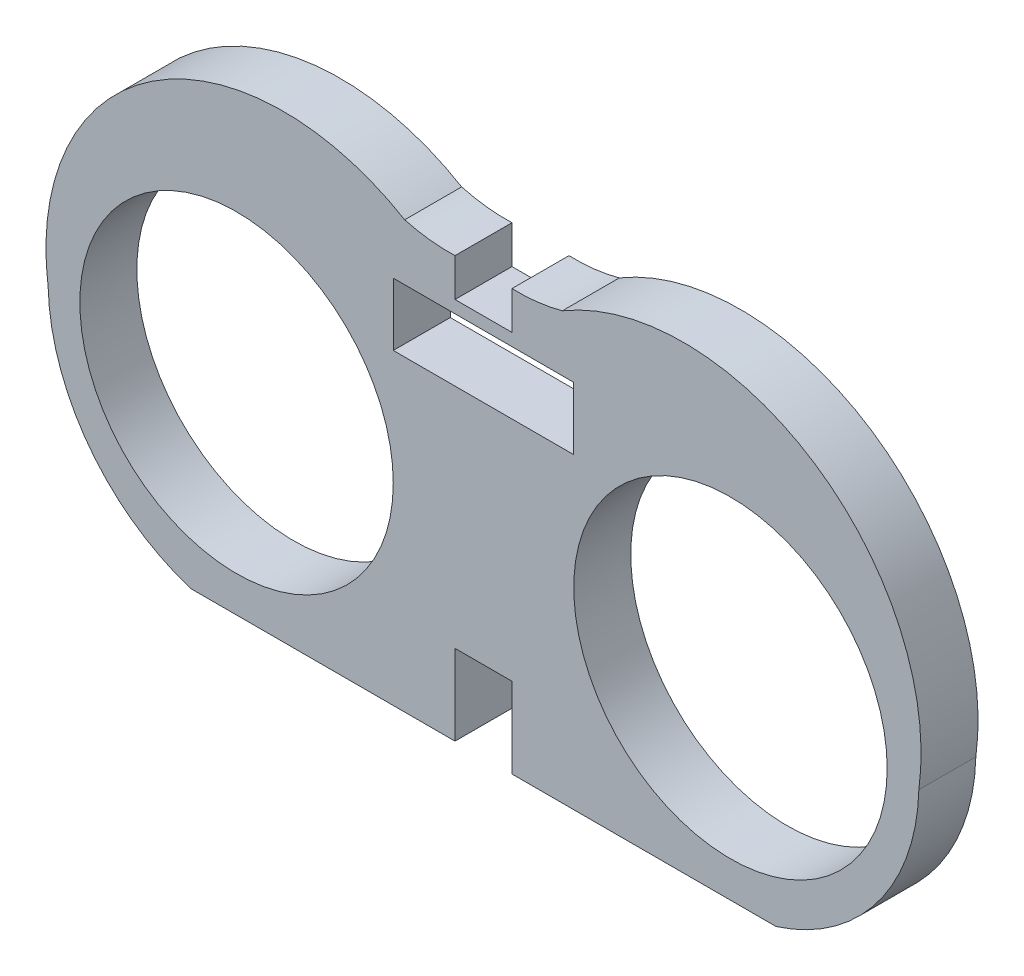
ISO-10303-21;
HEADER;
FILE_DESCRIPTION(('STEP AP214'),'2;1');
FILE_NAME('part.step','',(''),(''),'','','');
FILE_SCHEMA(('AUTOMOTIVE_DESIGN { 1 0 10303 214 1 1 1 1 }'));
ENDSEC;
DATA;
#1=APPLICATION_CONTEXT('core data for automotive mechanical design processes');
#2=APPLICATION_PROTOCOL_DEFINITION('international standard','automotive_design',2000,#1);
#3=PRODUCT_CONTEXT('',#1,'mechanical');
#4=PRODUCT('Part','Part','',(#3));
#5=PRODUCT_RELATED_PRODUCT_CATEGORY('part','',(#4));
#6=PRODUCT_DEFINITION_FORMATION('','',#4);
#7=PRODUCT_DEFINITION_CONTEXT('part definition',#1,'design');
#8=PRODUCT_DEFINITION('design','',#6,#7);
#9=PRODUCT_DEFINITION_SHAPE('','',#8);
#10=(LENGTH_UNIT() NAMED_UNIT(*) SI_UNIT(.MILLI.,.METRE.));
#11=(NAMED_UNIT(*) PLANE_ANGLE_UNIT() SI_UNIT($,.RADIAN.));
#12=(NAMED_UNIT(*) SI_UNIT($,.STERADIAN.) SOLID_ANGLE_UNIT());
#13=UNCERTAINTY_MEASURE_WITH_UNIT(LENGTH_MEASURE(1.E-05),#10,'distance_accuracy_value','');
#14=(GEOMETRIC_REPRESENTATION_CONTEXT(3) GLOBAL_UNCERTAINTY_ASSIGNED_CONTEXT((#13)) GLOBAL_UNIT_ASSIGNED_CONTEXT((#10,
#11,#12)) REPRESENTATION_CONTEXT('',''));
#15=CARTESIAN_POINT('',(0.,0.,0.));
#16=DIRECTION('',(0.,0.,1.));
#17=DIRECTION('',(1.,0.,0.));
#18=AXIS2_PLACEMENT_3D('',#15,#16,#17);
#19=CARTESIAN_POINT('',(0.,9.348,-3.));
#20=DIRECTION('',(0.,-1.,0.));
#21=DIRECTION('',(0.,0.,-1.));
#22=AXIS2_PLACEMENT_3D('',#19,#20,#21);
#23=PLANE('',#22);
#24=DIRECTION('',(1.,0.,0.));
#25=VECTOR('',#24,1.);
#26=CARTESIAN_POINT('',(0.,9.348,0.));
#27=LINE('',#26,#25);
#28=CARTESIAN_POINT('',(-4.75,9.348,0.));
#29=VERTEX_POINT('',#28);
#30=CARTESIAN_POINT('',(4.75,9.348,0.));
#31=VERTEX_POINT('',#30);
#32=EDGE_CURVE('E240',#29,#31,#27,.T.);
#33=ORIENTED_EDGE('',*,*,#32,.F.);
#34=DIRECTION('',(0.,0.,1.));
#35=VECTOR('',#34,1.);
#36=CARTESIAN_POINT('',(-4.75,9.348,-3.));
#37=LINE('',#36,#35);
#38=CARTESIAN_POINT('',(-4.75,9.348,-3.));
#39=VERTEX_POINT('',#38);
#40=EDGE_CURVE('E11',#39,#29,#37,.T.);
#41=ORIENTED_EDGE('',*,*,#40,.F.);
#42=DIRECTION('',(1.,0.,0.));
#43=VECTOR('',#42,1.);
#44=CARTESIAN_POINT('',(0.,9.348,-3.));
#45=LINE('',#44,#43);
#46=CARTESIAN_POINT('',(4.75,9.348,-3.));
#47=VERTEX_POINT('',#46);
#48=EDGE_CURVE('E186',#39,#47,#45,.T.);
#49=ORIENTED_EDGE('',*,*,#48,.T.);
#50=DIRECTION('',(0.,0.,1.));
#51=VECTOR('',#50,1.);
#52=CARTESIAN_POINT('',(4.75,9.348,-3.));
#53=LINE('',#52,#51);
#54=EDGE_CURVE('E183',#47,#31,#53,.T.);
#55=ORIENTED_EDGE('',*,*,#54,.T.);
#56=EDGE_LOOP('',(#33,#41,#49,#55));
#57=FACE_BOUND('',#56,.T.);
#58=ADVANCED_FACE('F35',(#57),#23,.T.);
#59=CARTESIAN_POINT('',(-4.75,0.,-3.));
#60=DIRECTION('',(-1.,0.,0.));
#61=DIRECTION('',(0.,0.,1.));
#62=AXIS2_PLACEMENT_3D('',#59,#60,#61);
#63=PLANE('',#62);
#64=DIRECTION('',(0.,-1.,0.));
#65=VECTOR('',#64,1.);
#66=CARTESIAN_POINT('',(-4.75,0.,0.));
#67=LINE('',#66,#65);
#68=CARTESIAN_POINT('',(-4.75,6.052,0.));
#69=VERTEX_POINT('',#68);
#70=EDGE_CURVE('E246',#29,#69,#67,.T.);
#71=ORIENTED_EDGE('',*,*,#70,.T.);
#72=DIRECTION('',(0.,0.,1.));
#73=VECTOR('',#72,1.);
#74=CARTESIAN_POINT('',(-4.75,6.052,-3.));
#75=LINE('',#74,#73);
#76=CARTESIAN_POINT('',(-4.75,6.052,-3.));
#77=VERTEX_POINT('',#76);
#78=EDGE_CURVE('E45',#77,#69,#75,.T.);
#79=ORIENTED_EDGE('',*,*,#78,.F.);
#80=DIRECTION('',(0.,-1.,0.));
#81=VECTOR('',#80,1.);
#82=CARTESIAN_POINT('',(-4.75,0.,-3.));
#83=LINE('',#82,#81);
#84=EDGE_CURVE('E175',#39,#77,#83,.T.);
#85=ORIENTED_EDGE('',*,*,#84,.F.);
#86=ORIENTED_EDGE('',*,*,#40,.T.);
#87=EDGE_LOOP('',(#71,#79,#85,#86));
#88=FACE_BOUND('',#87,.T.);
#89=ADVANCED_FACE('F299',(#88),#63,.F.);
#90=CARTESIAN_POINT('',(0.,6.052,-3.));
#91=DIRECTION('',(0.,-1.,0.));
#92=DIRECTION('',(0.,0.,-1.));
#93=AXIS2_PLACEMENT_3D('',#90,#91,#92);
#94=PLANE('',#93);
#95=DIRECTION('',(1.,0.,0.));
#96=VECTOR('',#95,1.);
#97=CARTESIAN_POINT('',(0.,6.052,0.));
#98=LINE('',#97,#96);
#99=CARTESIAN_POINT('',(4.75,6.052,0.));
#100=VERTEX_POINT('',#99);
#101=EDGE_CURVE('E112',#69,#100,#98,.T.);
#102=ORIENTED_EDGE('',*,*,#101,.T.);
#103=DIRECTION('',(0.,0.,1.));
#104=VECTOR('',#103,1.);
#105=CARTESIAN_POINT('',(4.75,6.052,-3.));
#106=LINE('',#105,#104);
#107=CARTESIAN_POINT('',(4.75,6.052,-3.));
#108=VERTEX_POINT('',#107);
#109=EDGE_CURVE('E179',#108,#100,#106,.T.);
#110=ORIENTED_EDGE('',*,*,#109,.F.);
#111=DIRECTION('',(1.,0.,0.));
#112=VECTOR('',#111,1.);
#113=CARTESIAN_POINT('',(0.,6.052,-3.));
#114=LINE('',#113,#112);
#115=EDGE_CURVE('E169',#77,#108,#114,.T.);
#116=ORIENTED_EDGE('',*,*,#115,.F.);
#117=ORIENTED_EDGE('',*,*,#78,.T.);
#118=EDGE_LOOP('',(#102,#110,#116,#117));
#119=FACE_BOUND('',#118,.T.);
#120=ADVANCED_FACE('F180',(#119),#94,.F.);
#121=CARTESIAN_POINT('',(-1.5,0.,-3.));
#122=DIRECTION('',(-1.,0.,0.));
#123=DIRECTION('',(0.,-1.,0.));
#124=AXIS2_PLACEMENT_3D('',#121,#122,#123);
#125=PLANE('',#124);
#126=DIRECTION('',(0.,-1.,0.));
#127=VECTOR('',#126,1.);
#128=CARTESIAN_POINT('',(-1.5,0.,0.));
#129=LINE('',#128,#127);
#130=CARTESIAN_POINT('',(-1.5,-5.904,0.));
#131=VERTEX_POINT('',#130);
#132=CARTESIAN_POINT('',(-1.5,-10.135,0.));
#133=VERTEX_POINT('',#132);
#134=EDGE_CURVE('E193',#131,#133,#129,.T.);
#135=ORIENTED_EDGE('',*,*,#134,.T.);
#136=DIRECTION('',(0.,0.,1.));
#137=VECTOR('',#136,1.);
#138=CARTESIAN_POINT('',(-1.5,-10.135,-3.));
#139=LINE('',#138,#137);
#140=CARTESIAN_POINT('',(-1.5,-10.135,-3.));
#141=VERTEX_POINT('',#140);
#142=EDGE_CURVE('E251',#141,#133,#139,.T.);
#143=ORIENTED_EDGE('',*,*,#142,.F.);
#144=DIRECTION('',(0.,-1.,0.));
#145=VECTOR('',#144,1.);
#146=CARTESIAN_POINT('',(-1.5,0.,-3.));
#147=LINE('',#146,#145);
#148=CARTESIAN_POINT('',(-1.5,-5.904,-3.));
#149=VERTEX_POINT('',#148);
#150=EDGE_CURVE('E247',#149,#141,#147,.T.);
#151=ORIENTED_EDGE('',*,*,#150,.F.);
#152=DIRECTION('',(0.,0.,1.));
#153=VECTOR('',#152,1.);
#154=CARTESIAN_POINT('',(-1.5,-5.904,-3.));
#155=LINE('',#154,#153);
#156=EDGE_CURVE('E39',#149,#131,#155,.T.);
#157=ORIENTED_EDGE('',*,*,#156,.T.);
#158=EDGE_LOOP('',(#135,#143,#151,#157));
#159=FACE_BOUND('',#158,.T.);
#160=ADVANCED_FACE('F37',(#159),#125,.F.);
#161=CARTESIAN_POINT('',(0.,-10.135,-3.));
#162=DIRECTION('',(0.,1.,0.));
#163=DIRECTION('',(-1.,0.,0.));
#164=AXIS2_PLACEMENT_3D('',#161,#162,#163);
#165=PLANE('',#164);
#166=DIRECTION('',(-1.,0.,0.));
#167=VECTOR('',#166,1.);
#168=CARTESIAN_POINT('',(0.,-10.135,0.));
#169=LINE('',#168,#167);
#170=CARTESIAN_POINT('',(-15.405,-10.135,0.));
#171=VERTEX_POINT('',#170);
#172=EDGE_CURVE('E231',#133,#171,#169,.T.);
#173=ORIENTED_EDGE('',*,*,#172,.T.);
#174=DIRECTION('',(0.,0.,1.));
#175=VECTOR('',#174,1.);
#176=CARTESIAN_POINT('',(-15.405,-10.135,-3.));
#177=LINE('',#176,#175);
#178=CARTESIAN_POINT('',(-15.405,-10.135,-3.));
#179=VERTEX_POINT('',#178);
#180=EDGE_CURVE('E254',#179,#171,#177,.T.);
#181=ORIENTED_EDGE('',*,*,#180,.F.);
#182=DIRECTION('',(-1.,0.,0.));
#183=VECTOR('',#182,1.);
#184=CARTESIAN_POINT('',(0.,-10.135,-3.));
#185=LINE('',#184,#183);
#186=EDGE_CURVE('E398',#141,#179,#185,.T.);
#187=ORIENTED_EDGE('',*,*,#186,.F.);
#188=ORIENTED_EDGE('',*,*,#142,.T.);
#189=EDGE_LOOP('',(#173,#181,#187,#188));
#190=FACE_BOUND('',#189,.T.);
#191=ADVANCED_FACE('F311',(#190),#165,.F.);
#192=CARTESIAN_POINT('',(-12.1365272034001,0.142806700745364,-3.));
#193=DIRECTION('',(0.,0.,1.));
#194=DIRECTION('',(1.,0.,0.));
#195=AXIS2_PLACEMENT_3D('',#192,#193,#194);
#196=CYLINDRICAL_SURFACE('',#195,10.785);
#197=CARTESIAN_POINT('',(-12.1365272034001,0.142806700745364,0.));
#198=DIRECTION('',(0.,0.,1.));
#199=DIRECTION('',(1.,0.,0.));
#200=AXIS2_PLACEMENT_3D('',#197,#198,#199);
#201=CIRCLE('',#200,10.785);
#202=CARTESIAN_POINT('',(-22.9178012395506,-0.140663152020516,0.));
#203=VERTEX_POINT('',#202);
#204=EDGE_CURVE('E228',#203,#171,#201,.T.);
#205=ORIENTED_EDGE('',*,*,#204,.F.);
#206=DIRECTION('',(0.,0.,1.));
#207=VECTOR('',#206,1.);
#208=CARTESIAN_POINT('',(-22.9178012395506,-0.140663152020516,-3.));
#209=LINE('',#208,#207);
#210=CARTESIAN_POINT('',(-22.9178012395506,-0.140663152020516,-3.));
#211=VERTEX_POINT('',#210);
#212=EDGE_CURVE('E256',#211,#203,#209,.T.);
#213=ORIENTED_EDGE('',*,*,#212,.F.);
#214=CARTESIAN_POINT('',(-12.1365272034001,0.142806700745364,-3.));
#215=DIRECTION('',(0.,0.,1.));
#216=DIRECTION('',(1.,0.,0.));
#217=AXIS2_PLACEMENT_3D('',#214,#215,#216);
#218=CIRCLE('',#217,10.785);
#219=EDGE_CURVE('E397',#211,#179,#218,.T.);
#220=ORIENTED_EDGE('',*,*,#219,.T.);
#221=ORIENTED_EDGE('',*,*,#180,.T.);
#222=EDGE_LOOP('',(#205,#213,#220,#221));
#223=FACE_BOUND('',#222,.T.);
#224=ADVANCED_FACE('F314',(#223),#196,.T.);
#225=CARTESIAN_POINT('',(-10.5344470705388,1.56302095156764,-3.));
#226=DIRECTION('',(0.,0.,1.));
#227=DIRECTION('',(1.,0.,0.));
#228=AXIS2_PLACEMENT_3D('',#225,#226,#227);
#229=CYLINDRICAL_SURFACE('',#228,12.5);
#230=CARTESIAN_POINT('',(-10.5344470705388,1.56302095156764,0.));
#231=DIRECTION('',(0.,0.,1.));
#232=DIRECTION('',(1.,0.,0.));
#233=AXIS2_PLACEMENT_3D('',#230,#231,#232);
#234=CIRCLE('',#233,12.5);
#235=CARTESIAN_POINT('',(-4.149,12.309,0.));
#236=VERTEX_POINT('',#235);
#237=EDGE_CURVE('E225',#236,#203,#234,.T.);
#238=ORIENTED_EDGE('',*,*,#237,.F.);
#239=DIRECTION('',(0.,0.,1.));
#240=VECTOR('',#239,1.);
#241=CARTESIAN_POINT('',(-4.149,12.309,-3.));
#242=LINE('',#241,#240);
#243=CARTESIAN_POINT('',(-4.149,12.309,-3.));
#244=VERTEX_POINT('',#243);
#245=EDGE_CURVE('E258',#244,#236,#242,.T.);
#246=ORIENTED_EDGE('',*,*,#245,.F.);
#247=CARTESIAN_POINT('',(-10.5344470705388,1.56302095156764,-3.));
#248=DIRECTION('',(0.,0.,1.));
#249=DIRECTION('',(1.,0.,0.));
#250=AXIS2_PLACEMENT_3D('',#247,#248,#249);
#251=CIRCLE('',#250,12.5);
#252=EDGE_CURVE('E393',#244,#211,#251,.T.);
#253=ORIENTED_EDGE('',*,*,#252,.T.);
#254=ORIENTED_EDGE('',*,*,#212,.T.);
#255=EDGE_LOOP('',(#238,#246,#253,#254));
#256=FACE_BOUND('',#255,.T.);
#257=ADVANCED_FACE('F318',(#256),#229,.T.);
#258=CARTESIAN_POINT('',(-1.81621756786161,20.7983192968757,-3.));
#259=DIRECTION('',(0.,0.,1.));
#260=DIRECTION('',(1.,0.,0.));
#261=AXIS2_PLACEMENT_3D('',#258,#259,#260);
#262=CYLINDRICAL_SURFACE('',#261,8.804);
#263=CARTESIAN_POINT('',(-1.81621756786161,20.7983192968757,0.));
#264=DIRECTION('',(0.,0.,1.));
#265=DIRECTION('',(1.,0.,0.));
#266=AXIS2_PLACEMENT_3D('',#263,#264,#265);
#267=CIRCLE('',#266,8.804);
#268=CARTESIAN_POINT('',(-1.5,12.,0.));
#269=VERTEX_POINT('',#268);
#270=EDGE_CURVE('E222',#236,#269,#267,.T.);
#271=ORIENTED_EDGE('',*,*,#270,.T.);
#272=DIRECTION('',(0.,0.,1.));
#273=VECTOR('',#272,1.);
#274=CARTESIAN_POINT('',(-1.5,12.,-3.));
#275=LINE('',#274,#273);
#276=CARTESIAN_POINT('',(-1.5,12.,-3.));
#277=VERTEX_POINT('',#276);
#278=EDGE_CURVE('E260',#277,#269,#275,.T.);
#279=ORIENTED_EDGE('',*,*,#278,.F.);
#280=CARTESIAN_POINT('',(-1.81621756786161,20.7983192968757,-3.));
#281=DIRECTION('',(0.,0.,1.));
#282=DIRECTION('',(1.,0.,0.));
#283=AXIS2_PLACEMENT_3D('',#280,#281,#282);
#284=CIRCLE('',#283,8.804);
#285=EDGE_CURVE('E418',#244,#277,#284,.T.);
#286=ORIENTED_EDGE('',*,*,#285,.F.);
#287=ORIENTED_EDGE('',*,*,#245,.T.);
#288=EDGE_LOOP('',(#271,#279,#286,#287));
#289=FACE_BOUND('',#288,.T.);
#290=ADVANCED_FACE('F322',(#289),#262,.F.);
#291=CARTESIAN_POINT('',(-1.5,0.,-3.));
#292=DIRECTION('',(1.,0.,0.));
#293=DIRECTION('',(0.,0.,-1.));
#294=AXIS2_PLACEMENT_3D('',#291,#292,#293);
#295=PLANE('',#294);
#296=DIRECTION('',(0.,1.,0.));
#297=VECTOR('',#296,1.);
#298=CARTESIAN_POINT('',(-1.5,0.,0.));
#299=LINE('',#298,#297);
#300=CARTESIAN_POINT('',(-1.5,10.,0.));
#301=VERTEX_POINT('',#300);
#302=EDGE_CURVE('E219',#301,#269,#299,.T.);
#303=ORIENTED_EDGE('',*,*,#302,.F.);
#304=DIRECTION('',(0.,0.,1.));
#305=VECTOR('',#304,1.);
#306=CARTESIAN_POINT('',(-1.5,10.,-3.));
#307=LINE('',#306,#305);
#308=CARTESIAN_POINT('',(-1.5,10.,-3.));
#309=VERTEX_POINT('',#308);
#310=EDGE_CURVE('E262',#309,#301,#307,.T.);
#311=ORIENTED_EDGE('',*,*,#310,.F.);
#312=DIRECTION('',(0.,1.,0.));
#313=VECTOR('',#312,1.);
#314=CARTESIAN_POINT('',(-1.5,0.,-3.));
#315=LINE('',#314,#313);
#316=EDGE_CURVE('E416',#309,#277,#315,.T.);
#317=ORIENTED_EDGE('',*,*,#316,.T.);
#318=ORIENTED_EDGE('',*,*,#278,.T.);
#319=EDGE_LOOP('',(#303,#311,#317,#318));
#320=FACE_BOUND('',#319,.T.);
#321=ADVANCED_FACE('F326',(#320),#295,.T.);
#322=CARTESIAN_POINT('',(0.,10.,-3.));
#323=DIRECTION('',(0.,1.,0.));
#324=DIRECTION('',(0.,0.,1.));
#325=AXIS2_PLACEMENT_3D('',#322,#323,#324);
#326=PLANE('',#325);
#327=DIRECTION('',(-1.,0.,0.));
#328=VECTOR('',#327,1.);
#329=CARTESIAN_POINT('',(0.,10.,0.));
#330=LINE('',#329,#328);
#331=CARTESIAN_POINT('',(1.5,10.,0.));
#332=VERTEX_POINT('',#331);
#333=EDGE_CURVE('E216',#332,#301,#330,.T.);
#334=ORIENTED_EDGE('',*,*,#333,.F.);
#335=DIRECTION('',(0.,0.,1.));
#336=VECTOR('',#335,1.);
#337=CARTESIAN_POINT('',(1.5,10.,-3.));
#338=LINE('',#337,#336);
#339=CARTESIAN_POINT('',(1.5,10.,-3.));
#340=VERTEX_POINT('',#339);
#341=EDGE_CURVE('E264',#340,#332,#338,.T.);
#342=ORIENTED_EDGE('',*,*,#341,.F.);
#343=DIRECTION('',(-1.,0.,0.));
#344=VECTOR('',#343,1.);
#345=CARTESIAN_POINT('',(0.,10.,-3.));
#346=LINE('',#345,#344);
#347=EDGE_CURVE('E383',#340,#309,#346,.T.);
#348=ORIENTED_EDGE('',*,*,#347,.T.);
#349=ORIENTED_EDGE('',*,*,#310,.T.);
#350=EDGE_LOOP('',(#334,#342,#348,#349));
#351=FACE_BOUND('',#350,.T.);
#352=ADVANCED_FACE('F330',(#351),#326,.T.);
#353=CARTESIAN_POINT('',(1.5,0.,-3.));
#354=DIRECTION('',(1.,0.,0.));
#355=DIRECTION('',(0.,0.,-1.));
#356=AXIS2_PLACEMENT_3D('',#353,#354,#355);
#357=PLANE('',#356);
#358=DIRECTION('',(0.,1.,0.));
#359=VECTOR('',#358,1.);
#360=CARTESIAN_POINT('',(1.5,0.,0.));
#361=LINE('',#360,#359);
#362=CARTESIAN_POINT('',(1.5,12.,0.));
#363=VERTEX_POINT('',#362);
#364=EDGE_CURVE('E213',#332,#363,#361,.T.);
#365=ORIENTED_EDGE('',*,*,#364,.T.);
#366=DIRECTION('',(0.,0.,1.));
#367=VECTOR('',#366,1.);
#368=CARTESIAN_POINT('',(1.5,12.,-3.));
#369=LINE('',#368,#367);
#370=CARTESIAN_POINT('',(1.5,12.,-3.));
#371=VERTEX_POINT('',#370);
#372=EDGE_CURVE('E266',#371,#363,#369,.T.);
#373=ORIENTED_EDGE('',*,*,#372,.F.);
#374=DIRECTION('',(0.,1.,0.));
#375=VECTOR('',#374,1.);
#376=CARTESIAN_POINT('',(1.5,0.,-3.));
#377=LINE('',#376,#375);
#378=EDGE_CURVE('E413',#340,#371,#377,.T.);
#379=ORIENTED_EDGE('',*,*,#378,.F.);
#380=ORIENTED_EDGE('',*,*,#341,.T.);
#381=EDGE_LOOP('',(#365,#373,#379,#380));
#382=FACE_BOUND('',#381,.T.);
#383=ADVANCED_FACE('F334',(#382),#357,.F.);
#384=CARTESIAN_POINT('',(1.81621756786161,20.7983192968757,-3.));
#385=DIRECTION('',(0.,0.,1.));
#386=DIRECTION('',(1.,0.,0.));
#387=AXIS2_PLACEMENT_3D('',#384,#385,#386);
#388=CYLINDRICAL_SURFACE('',#387,8.804);
#389=CARTESIAN_POINT('',(1.81621756786161,20.7983192968757,0.));
#390=DIRECTION('',(0.,0.,1.));
#391=DIRECTION('',(1.,0.,0.));
#392=AXIS2_PLACEMENT_3D('',#389,#390,#391);
#393=CIRCLE('',#392,8.804);
#394=CARTESIAN_POINT('',(4.149,12.309,0.));
#395=VERTEX_POINT('',#394);
#396=EDGE_CURVE('E210',#395,#363,#393,.F.);
#397=ORIENTED_EDGE('',*,*,#396,.F.);
#398=DIRECTION('',(0.,0.,1.));
#399=VECTOR('',#398,1.);
#400=CARTESIAN_POINT('',(4.149,12.309,-3.));
#401=LINE('',#400,#399);
#402=CARTESIAN_POINT('',(4.149,12.309,-3.));
#403=VERTEX_POINT('',#402);
#404=EDGE_CURVE('E268',#403,#395,#401,.T.);
#405=ORIENTED_EDGE('',*,*,#404,.F.);
#406=CARTESIAN_POINT('',(1.81621756786161,20.7983192968757,-3.));
#407=DIRECTION('',(0.,0.,1.));
#408=DIRECTION('',(1.,0.,0.));
#409=AXIS2_PLACEMENT_3D('',#406,#407,#408);
#410=CIRCLE('',#409,8.804);
#411=EDGE_CURVE('E377',#403,#371,#410,.F.);
#412=ORIENTED_EDGE('',*,*,#411,.T.);
#413=ORIENTED_EDGE('',*,*,#372,.T.);
#414=EDGE_LOOP('',(#397,#405,#412,#413));
#415=FACE_BOUND('',#414,.T.);
#416=ADVANCED_FACE('F338',(#415),#388,.F.);
#417=CARTESIAN_POINT('',(10.5344470705388,1.56302095156764,-3.));
#418=DIRECTION('',(0.,0.,1.));
#419=DIRECTION('',(1.,0.,0.));
#420=AXIS2_PLACEMENT_3D('',#417,#418,#419);
#421=CYLINDRICAL_SURFACE('',#420,12.5);
#422=CARTESIAN_POINT('',(10.5344470705388,1.56302095156764,0.));
#423=DIRECTION('',(0.,0.,1.));
#424=DIRECTION('',(1.,0.,0.));
#425=AXIS2_PLACEMENT_3D('',#422,#423,#424);
#426=CIRCLE('',#425,12.5);
#427=CARTESIAN_POINT('',(22.9178012395506,-0.14066315202052,0.));
#428=VERTEX_POINT('',#427);
#429=EDGE_CURVE('E208',#395,#428,#426,.F.);
#430=ORIENTED_EDGE('',*,*,#429,.T.);
#431=DIRECTION('',(0.,0.,1.));
#432=VECTOR('',#431,1.);
#433=CARTESIAN_POINT('',(22.9178012395506,-0.14066315202052,-3.));
#434=LINE('',#433,#432);
#435=CARTESIAN_POINT('',(22.9178012395506,-0.14066315202052,-3.));
#436=VERTEX_POINT('',#435);
#437=EDGE_CURVE('E270',#436,#428,#434,.T.);
#438=ORIENTED_EDGE('',*,*,#437,.F.);
#439=CARTESIAN_POINT('',(10.5344470705388,1.56302095156764,-3.));
#440=DIRECTION('',(0.,0.,1.));
#441=DIRECTION('',(1.,0.,0.));
#442=AXIS2_PLACEMENT_3D('',#439,#440,#441);
#443=CIRCLE('',#442,12.5);
#444=EDGE_CURVE('E371',#403,#436,#443,.F.);
#445=ORIENTED_EDGE('',*,*,#444,.F.);
#446=ORIENTED_EDGE('',*,*,#404,.T.);
#447=EDGE_LOOP('',(#430,#438,#445,#446));
#448=FACE_BOUND('',#447,.T.);
#449=ADVANCED_FACE('F342',(#448),#421,.T.);
#450=CARTESIAN_POINT('',(12.1365272034001,0.142806700745364,-3.));
#451=DIRECTION('',(0.,0.,1.));
#452=DIRECTION('',(1.,0.,0.));
#453=AXIS2_PLACEMENT_3D('',#450,#451,#452);
#454=CYLINDRICAL_SURFACE('',#453,10.785);
#455=CARTESIAN_POINT('',(12.1365272034001,0.142806700745364,0.));
#456=DIRECTION('',(0.,0.,1.));
#457=DIRECTION('',(1.,0.,0.));
#458=AXIS2_PLACEMENT_3D('',#455,#456,#457);
#459=CIRCLE('',#458,10.785);
#460=CARTESIAN_POINT('',(15.405,-10.135,0.));
#461=VERTEX_POINT('',#460);
#462=EDGE_CURVE('E205',#428,#461,#459,.F.);
#463=ORIENTED_EDGE('',*,*,#462,.T.);
#464=DIRECTION('',(0.,0.,1.));
#465=VECTOR('',#464,1.);
#466=CARTESIAN_POINT('',(15.405,-10.135,-3.));
#467=LINE('',#466,#465);
#468=CARTESIAN_POINT('',(15.405,-10.135,-3.));
#469=VERTEX_POINT('',#468);
#470=EDGE_CURVE('E273',#469,#461,#467,.T.);
#471=ORIENTED_EDGE('',*,*,#470,.F.);
#472=CARTESIAN_POINT('',(12.1365272034001,0.142806700745364,-3.));
#473=DIRECTION('',(0.,0.,1.));
#474=DIRECTION('',(1.,0.,0.));
#475=AXIS2_PLACEMENT_3D('',#472,#473,#474);
#476=CIRCLE('',#475,10.785);
#477=EDGE_CURVE('E369',#436,#469,#476,.F.);
#478=ORIENTED_EDGE('',*,*,#477,.F.);
#479=ORIENTED_EDGE('',*,*,#437,.T.);
#480=EDGE_LOOP('',(#463,#471,#478,#479));
#481=FACE_BOUND('',#480,.T.);
#482=ADVANCED_FACE('F346',(#481),#454,.T.);
#483=CARTESIAN_POINT('',(0.,-10.135,-3.));
#484=DIRECTION('',(0.,-1.,0.));
#485=DIRECTION('',(1.,0.,0.));
#486=AXIS2_PLACEMENT_3D('',#483,#484,#485);
#487=PLANE('',#486);
#488=DIRECTION('',(1.,0.,0.));
#489=VECTOR('',#488,1.);
#490=CARTESIAN_POINT('',(0.,-10.135,0.));
#491=LINE('',#490,#489);
#492=CARTESIAN_POINT('',(1.5,-10.135,0.));
#493=VERTEX_POINT('',#492);
#494=EDGE_CURVE('E202',#493,#461,#491,.T.);
#495=ORIENTED_EDGE('',*,*,#494,.F.);
#496=DIRECTION('',(0.,0.,1.));
#497=VECTOR('',#496,1.);
#498=CARTESIAN_POINT('',(1.5,-10.135,-3.));
#499=LINE('',#498,#497);
#500=CARTESIAN_POINT('',(1.5,-10.135,-3.));
#501=VERTEX_POINT('',#500);
#502=EDGE_CURVE('E275',#501,#493,#499,.T.);
#503=ORIENTED_EDGE('',*,*,#502,.F.);
#504=DIRECTION('',(1.,0.,0.));
#505=VECTOR('',#504,1.);
#506=CARTESIAN_POINT('',(0.,-10.135,-3.));
#507=LINE('',#506,#505);
#508=EDGE_CURVE('E366',#501,#469,#507,.T.);
#509=ORIENTED_EDGE('',*,*,#508,.T.);
#510=ORIENTED_EDGE('',*,*,#470,.T.);
#511=EDGE_LOOP('',(#495,#503,#509,#510));
#512=FACE_BOUND('',#511,.T.);
#513=ADVANCED_FACE('F350',(#512),#487,.T.);
#514=CARTESIAN_POINT('',(1.5,0.,-3.));
#515=DIRECTION('',(-1.,0.,0.));
#516=DIRECTION('',(0.,-1.,0.));
#517=AXIS2_PLACEMENT_3D('',#514,#515,#516);
#518=PLANE('',#517);
#519=DIRECTION('',(0.,-1.,0.));
#520=VECTOR('',#519,1.);
#521=CARTESIAN_POINT('',(1.5,0.,0.));
#522=LINE('',#521,#520);
#523=CARTESIAN_POINT('',(1.5,-5.904,0.));
#524=VERTEX_POINT('',#523);
#525=EDGE_CURVE('E199',#524,#493,#522,.T.);
#526=ORIENTED_EDGE('',*,*,#525,.F.);
#527=DIRECTION('',(0.,0.,1.));
#528=VECTOR('',#527,1.);
#529=CARTESIAN_POINT('',(1.5,-5.904,-3.));
#530=LINE('',#529,#528);
#531=CARTESIAN_POINT('',(1.5,-5.904,-3.));
#532=VERTEX_POINT('',#531);
#533=EDGE_CURVE('E276',#532,#524,#530,.T.);
#534=ORIENTED_EDGE('',*,*,#533,.F.);
#535=DIRECTION('',(0.,-1.,0.));
#536=VECTOR('',#535,1.);
#537=CARTESIAN_POINT('',(1.5,0.,-3.));
#538=LINE('',#537,#536);
#539=EDGE_CURVE('E405',#532,#501,#538,.T.);
#540=ORIENTED_EDGE('',*,*,#539,.T.);
#541=ORIENTED_EDGE('',*,*,#502,.T.);
#542=EDGE_LOOP('',(#526,#534,#540,#541));
#543=FACE_BOUND('',#542,.T.);
#544=ADVANCED_FACE('F308',(#543),#518,.T.);
#545=CARTESIAN_POINT('',(-13.,0.,-3.));
#546=DIRECTION('',(0.,0.,1.));
#547=DIRECTION('',(1.,0.,0.));
#548=AXIS2_PLACEMENT_3D('',#545,#546,#547);
#549=CYLINDRICAL_SURFACE('',#548,8.25);
#550=CARTESIAN_POINT('',(-13.,0.,-3.));
#551=DIRECTION('',(0.,0.,1.));
#552=DIRECTION('',(1.,0.,0.));
#553=AXIS2_PLACEMENT_3D('',#550,#551,#552);
#554=CIRCLE('',#553,8.25);
#555=CARTESIAN_POINT('',(-4.75,0.,-3.));
#556=VERTEX_POINT('',#555);
#557=EDGE_CURVE('E188',#556,#556,#554,.T.);
#558=ORIENTED_EDGE('',*,*,#557,.F.);
#559=EDGE_LOOP('',(#558));
#560=FACE_BOUND('',#559,.T.);
#561=CARTESIAN_POINT('',(-13.,0.,0.));
#562=DIRECTION('',(0.,0.,1.));
#563=DIRECTION('',(1.,0.,0.));
#564=AXIS2_PLACEMENT_3D('',#561,#562,#563);
#565=CIRCLE('',#564,8.25);
#566=CARTESIAN_POINT('',(-4.75,0.,0.));
#567=VERTEX_POINT('',#566);
#568=EDGE_CURVE('E237',#567,#567,#565,.T.);
#569=ORIENTED_EDGE('',*,*,#568,.T.);
#570=EDGE_LOOP('',(#569));
#571=FACE_BOUND('',#570,.T.);
#572=ADVANCED_FACE('F294',(#560,#571),#549,.F.);
#573=CARTESIAN_POINT('',(13.,0.,-3.));
#574=DIRECTION('',(0.,0.,1.));
#575=DIRECTION('',(1.,0.,0.));
#576=AXIS2_PLACEMENT_3D('',#573,#574,#575);
#577=CYLINDRICAL_SURFACE('',#576,8.25);
#578=CARTESIAN_POINT('',(13.,0.,-3.));
#579=DIRECTION('',(0.,0.,1.));
#580=DIRECTION('',(1.,0.,0.));
#581=AXIS2_PLACEMENT_3D('',#578,#579,#580);
#582=CIRCLE('',#581,8.25);
#583=CARTESIAN_POINT('',(21.25,0.,-3.));
#584=VERTEX_POINT('',#583);
#585=EDGE_CURVE('E400',#584,#584,#582,.F.);
#586=ORIENTED_EDGE('',*,*,#585,.T.);
#587=EDGE_LOOP('',(#586));
#588=FACE_BOUND('',#587,.T.);
#589=CARTESIAN_POINT('',(13.,0.,0.));
#590=DIRECTION('',(0.,0.,1.));
#591=DIRECTION('',(1.,0.,0.));
#592=AXIS2_PLACEMENT_3D('',#589,#590,#591);
#593=CIRCLE('',#592,8.25);
#594=CARTESIAN_POINT('',(21.25,0.,0.));
#595=VERTEX_POINT('',#594);
#596=EDGE_CURVE('E234',#595,#595,#593,.F.);
#597=ORIENTED_EDGE('',*,*,#596,.F.);
#598=EDGE_LOOP('',(#597));
#599=FACE_BOUND('',#598,.T.);
#600=ADVANCED_FACE('F288',(#588,#599),#577,.F.);
#601=CARTESIAN_POINT('',(0.,-5.904,-3.));
#602=DIRECTION('',(0.,-1.,0.));
#603=DIRECTION('',(0.,0.,-1.));
#604=AXIS2_PLACEMENT_3D('',#601,#602,#603);
#605=PLANE('',#604);
#606=DIRECTION('',(1.,0.,0.));
#607=VECTOR('',#606,1.);
#608=CARTESIAN_POINT('',(0.,-5.904,0.));
#609=LINE('',#608,#607);
#610=EDGE_CURVE('E196',#131,#524,#609,.T.);
#611=ORIENTED_EDGE('',*,*,#610,.F.);
#612=ORIENTED_EDGE('',*,*,#156,.F.);
#613=DIRECTION('',(1.,0.,0.));
#614=VECTOR('',#613,1.);
#615=CARTESIAN_POINT('',(0.,-5.904,-3.));
#616=LINE('',#615,#614);
#617=EDGE_CURVE('E403',#149,#532,#616,.T.);
#618=ORIENTED_EDGE('',*,*,#617,.T.);
#619=ORIENTED_EDGE('',*,*,#533,.T.);
#620=EDGE_LOOP('',(#611,#612,#618,#619));
#621=FACE_BOUND('',#620,.T.);
#622=ADVANCED_FACE('F286',(#621),#605,.T.);
#623=CARTESIAN_POINT('',(4.75,0.,-3.));
#624=DIRECTION('',(-1.,0.,0.));
#625=DIRECTION('',(0.,0.,1.));
#626=AXIS2_PLACEMENT_3D('',#623,#624,#625);
#627=PLANE('',#626);
#628=DIRECTION('',(0.,-1.,0.));
#629=VECTOR('',#628,1.);
#630=CARTESIAN_POINT('',(4.75,0.,0.));
#631=LINE('',#630,#629);
#632=EDGE_CURVE('E243',#31,#100,#631,.T.);
#633=ORIENTED_EDGE('',*,*,#632,.F.);
#634=ORIENTED_EDGE('',*,*,#54,.F.);
#635=DIRECTION('',(0.,-1.,0.));
#636=VECTOR('',#635,1.);
#637=CARTESIAN_POINT('',(4.75,0.,-3.));
#638=LINE('',#637,#636);
#639=EDGE_CURVE('E174',#47,#108,#638,.T.);
#640=ORIENTED_EDGE('',*,*,#639,.T.);
#641=ORIENTED_EDGE('',*,*,#109,.T.);
#642=EDGE_LOOP('',(#633,#634,#640,#641));
#643=FACE_BOUND('',#642,.T.);
#644=ADVANCED_FACE('F185',(#643),#627,.T.);
#645=CARTESIAN_POINT('',(0.,0.,-3.));
#646=DIRECTION('',(0.,0.,1.));
#647=DIRECTION('',(1.,0.,0.));
#648=AXIS2_PLACEMENT_3D('',#645,#646,#647);
#649=PLANE('',#648);
#650=ORIENTED_EDGE('',*,*,#150,.T.);
#651=ORIENTED_EDGE('',*,*,#186,.T.);
#652=ORIENTED_EDGE('',*,*,#219,.F.);
#653=ORIENTED_EDGE('',*,*,#252,.F.);
#654=ORIENTED_EDGE('',*,*,#285,.T.);
#655=ORIENTED_EDGE('',*,*,#316,.F.);
#656=ORIENTED_EDGE('',*,*,#347,.F.);
#657=ORIENTED_EDGE('',*,*,#378,.T.);
#658=ORIENTED_EDGE('',*,*,#411,.F.);
#659=ORIENTED_EDGE('',*,*,#444,.T.);
#660=ORIENTED_EDGE('',*,*,#477,.T.);
#661=ORIENTED_EDGE('',*,*,#508,.F.);
#662=ORIENTED_EDGE('',*,*,#539,.F.);
#663=ORIENTED_EDGE('',*,*,#617,.F.);
#664=EDGE_LOOP('',(#650,#651,#652,#653,#654,#655,#656,#657,#658,#659,#660,#661,#662,#663));
#665=FACE_BOUND('',#664,.T.);
#666=ORIENTED_EDGE('',*,*,#585,.F.);
#667=EDGE_LOOP('',(#666));
#668=FACE_BOUND('',#667,.T.);
#669=ORIENTED_EDGE('',*,*,#557,.T.);
#670=EDGE_LOOP('',(#669));
#671=FACE_BOUND('',#670,.T.);
#672=ORIENTED_EDGE('',*,*,#48,.F.);
#673=ORIENTED_EDGE('',*,*,#84,.T.);
#674=ORIENTED_EDGE('',*,*,#115,.T.);
#675=ORIENTED_EDGE('',*,*,#639,.F.);
#676=EDGE_LOOP('',(#672,#673,#674,#675));
#677=FACE_BOUND('',#676,.T.);
#678=ADVANCED_FACE('F172',(#665,#668,#671,#677),#649,.F.);
#679=CARTESIAN_POINT('',(0.,0.,0.));
#680=DIRECTION('',(0.,0.,1.));
#681=DIRECTION('',(1.,0.,0.));
#682=AXIS2_PLACEMENT_3D('',#679,#680,#681);
#683=PLANE('',#682);
#684=ORIENTED_EDGE('',*,*,#134,.F.);
#685=ORIENTED_EDGE('',*,*,#610,.T.);
#686=ORIENTED_EDGE('',*,*,#525,.T.);
#687=ORIENTED_EDGE('',*,*,#494,.T.);
#688=ORIENTED_EDGE('',*,*,#462,.F.);
#689=ORIENTED_EDGE('',*,*,#429,.F.);
#690=ORIENTED_EDGE('',*,*,#396,.T.);
#691=ORIENTED_EDGE('',*,*,#364,.F.);
#692=ORIENTED_EDGE('',*,*,#333,.T.);
#693=ORIENTED_EDGE('',*,*,#302,.T.);
#694=ORIENTED_EDGE('',*,*,#270,.F.);
#695=ORIENTED_EDGE('',*,*,#237,.T.);
#696=ORIENTED_EDGE('',*,*,#204,.T.);
#697=ORIENTED_EDGE('',*,*,#172,.F.);
#698=EDGE_LOOP('',(#684,#685,#686,#687,#688,#689,#690,#691,#692,#693,#694,#695,#696,#697));
#699=FACE_BOUND('',#698,.T.);
#700=ORIENTED_EDGE('',*,*,#596,.T.);
#701=EDGE_LOOP('',(#700));
#702=FACE_BOUND('',#701,.T.);
#703=ORIENTED_EDGE('',*,*,#568,.F.);
#704=EDGE_LOOP('',(#703));
#705=FACE_BOUND('',#704,.T.);
#706=ORIENTED_EDGE('',*,*,#32,.T.);
#707=ORIENTED_EDGE('',*,*,#632,.T.);
#708=ORIENTED_EDGE('',*,*,#101,.F.);
#709=ORIENTED_EDGE('',*,*,#70,.F.);
#710=EDGE_LOOP('',(#706,#707,#708,#709));
#711=FACE_BOUND('',#710,.T.);
#712=ADVANCED_FACE('F284',(#699,#702,#705,#711),#683,.T.);
#713=CLOSED_SHELL('',(#58,#89,#120,#160,#191,#224,#257,#290,#321,#352,#383,#416,#449,#482,#513,
#544,#572,#600,#622,#644,#678,#712));
#714=MANIFOLD_SOLID_BREP('B2',#713);
#715=ADVANCED_BREP_SHAPE_REPRESENTATION('',(#18,#714),#14);
#716=SHAPE_DEFINITION_REPRESENTATION(#9,#715);
ENDSEC;
END-ISO-10303-21;
